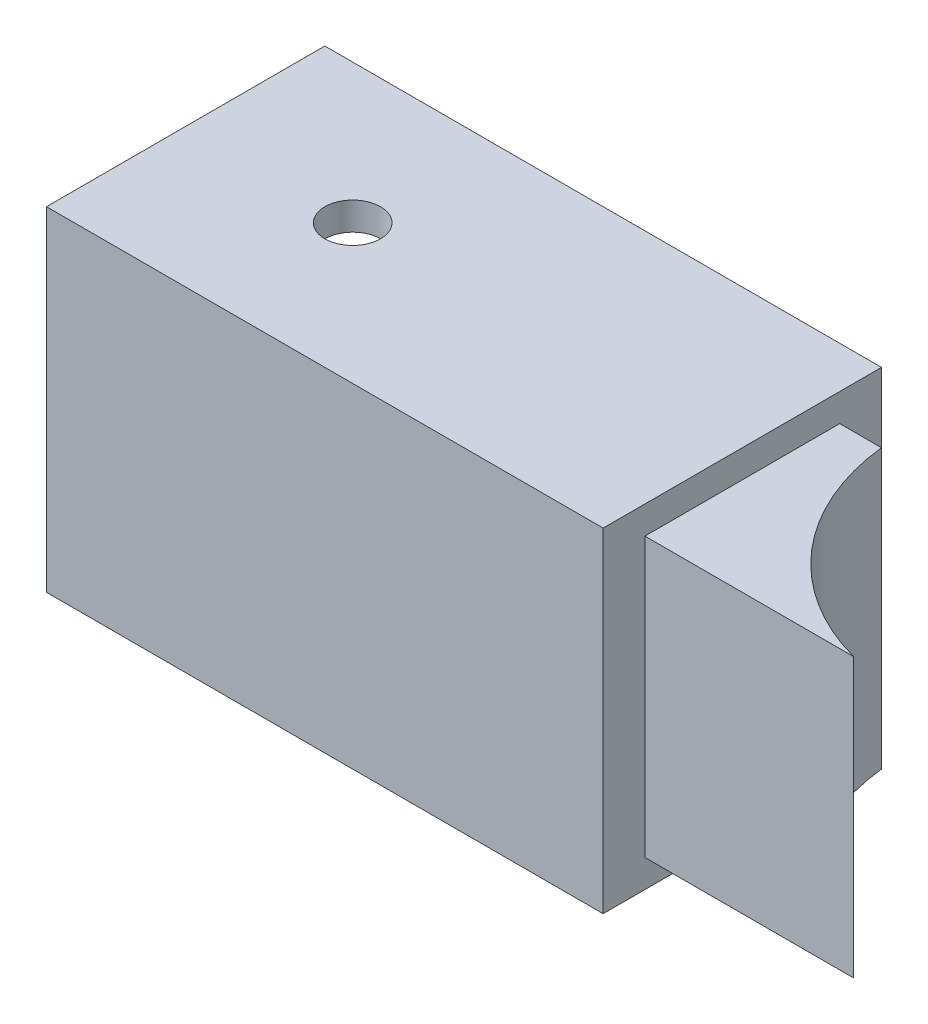
ISO-10303-21;
HEADER;
FILE_DESCRIPTION(('STEP AP214'),'2;1');
FILE_NAME('part.step','',(''),(''),'','','');
FILE_SCHEMA(('AUTOMOTIVE_DESIGN { 1 0 10303 214 1 1 1 1 }'));
ENDSEC;
DATA;
#1=APPLICATION_CONTEXT('core data for automotive mechanical design processes');
#2=APPLICATION_PROTOCOL_DEFINITION('international standard','automotive_design',2000,#1);
#3=PRODUCT_CONTEXT('',#1,'mechanical');
#4=PRODUCT('Part','Part','',(#3));
#5=PRODUCT_RELATED_PRODUCT_CATEGORY('part','',(#4));
#6=PRODUCT_DEFINITION_FORMATION('','',#4);
#7=PRODUCT_DEFINITION_CONTEXT('part definition',#1,'design');
#8=PRODUCT_DEFINITION('design','',#6,#7);
#9=PRODUCT_DEFINITION_SHAPE('','',#8);
#10=(LENGTH_UNIT() NAMED_UNIT(*) SI_UNIT(.MILLI.,.METRE.));
#11=(NAMED_UNIT(*) PLANE_ANGLE_UNIT() SI_UNIT($,.RADIAN.));
#12=(NAMED_UNIT(*) SI_UNIT($,.STERADIAN.) SOLID_ANGLE_UNIT());
#13=UNCERTAINTY_MEASURE_WITH_UNIT(LENGTH_MEASURE(1.E-05),#10,'distance_accuracy_value','');
#14=(GEOMETRIC_REPRESENTATION_CONTEXT(3) GLOBAL_UNCERTAINTY_ASSIGNED_CONTEXT((#13)) GLOBAL_UNIT_ASSIGNED_CONTEXT((#10,
#11,#12)) REPRESENTATION_CONTEXT('',''));
#15=CARTESIAN_POINT('',(0.,0.,0.));
#16=DIRECTION('',(0.,0.,1.));
#17=DIRECTION('',(1.,0.,0.));
#18=AXIS2_PLACEMENT_3D('',#15,#16,#17);
#19=CARTESIAN_POINT('',(-50.,-30.,50.));
#20=DIRECTION('',(-1.,0.,0.));
#21=DIRECTION('',(0.,0.,1.));
#22=AXIS2_PLACEMENT_3D('',#19,#20,#21);
#23=PLANE('',#22);
#24=DIRECTION('',(0.,1.,0.));
#25=VECTOR('',#24,1.);
#26=CARTESIAN_POINT('',(-50.,-30.,0.));
#27=LINE('',#26,#25);
#28=CARTESIAN_POINT('',(-50.,25.,0.));
#29=VERTEX_POINT('',#28);
#30=CARTESIAN_POINT('',(-50.,30.,0.));
#31=VERTEX_POINT('',#30);
#32=EDGE_CURVE('E319',#29,#31,#27,.T.);
#33=ORIENTED_EDGE('',*,*,#32,.F.);
#34=DIRECTION('',(0.,0.,-1.));
#35=VECTOR('',#34,1.);
#36=CARTESIAN_POINT('',(-50.,25.,50.));
#37=LINE('',#36,#35);
#38=CARTESIAN_POINT('',(-50.,25.,45.));
#39=VERTEX_POINT('',#38);
#40=EDGE_CURVE('E301',#39,#29,#37,.T.);
#41=ORIENTED_EDGE('',*,*,#40,.F.);
#42=DIRECTION('',(0.,1.,0.));
#43=VECTOR('',#42,1.);
#44=CARTESIAN_POINT('',(-50.,0.,45.));
#45=LINE('',#44,#43);
#46=CARTESIAN_POINT('',(-50.,-25.,45.));
#47=VERTEX_POINT('',#46);
#48=EDGE_CURVE('E290',#47,#39,#45,.T.);
#49=ORIENTED_EDGE('',*,*,#48,.F.);
#50=DIRECTION('',(0.,0.,-1.));
#51=VECTOR('',#50,1.);
#52=CARTESIAN_POINT('',(-50.,-25.,50.));
#53=LINE('',#52,#51);
#54=CARTESIAN_POINT('',(-50.,-25.,0.));
#55=VERTEX_POINT('',#54);
#56=EDGE_CURVE('E296',#47,#55,#53,.T.);
#57=ORIENTED_EDGE('',*,*,#56,.T.);
#58=CARTESIAN_POINT('',(-50.,-30.,0.));
#59=VERTEX_POINT('',#58);
#60=EDGE_CURVE('E340',#59,#55,#27,.T.);
#61=ORIENTED_EDGE('',*,*,#60,.F.);
#62=DIRECTION('',(0.,0.,-1.));
#63=VECTOR('',#62,1.);
#64=CARTESIAN_POINT('',(-50.,-30.,50.));
#65=LINE('',#64,#63);
#66=CARTESIAN_POINT('',(-50.,-30.,50.));
#67=VERTEX_POINT('',#66);
#68=EDGE_CURVE('E354',#67,#59,#65,.T.);
#69=ORIENTED_EDGE('',*,*,#68,.F.);
#70=DIRECTION('',(0.,1.,0.));
#71=VECTOR('',#70,1.);
#72=CARTESIAN_POINT('',(-50.,-30.,50.));
#73=LINE('',#72,#71);
#74=CARTESIAN_POINT('',(-50.,30.,50.));
#75=VERTEX_POINT('',#74);
#76=EDGE_CURVE('E324',#67,#75,#73,.T.);
#77=ORIENTED_EDGE('',*,*,#76,.T.);
#78=DIRECTION('',(0.,0.,-1.));
#79=VECTOR('',#78,1.);
#80=CARTESIAN_POINT('',(-50.,30.,50.));
#81=LINE('',#80,#79);
#82=EDGE_CURVE('E339',#75,#31,#81,.T.);
#83=ORIENTED_EDGE('',*,*,#82,.T.);
#84=EDGE_LOOP('',(#33,#41,#49,#57,#61,#69,#77,#83));
#85=FACE_BOUND('',#84,.T.);
#86=ADVANCED_FACE('F41',(#85),#23,.T.);
#87=CARTESIAN_POINT('',(-50.,-30.,50.));
#88=DIRECTION('',(0.,1.,0.));
#89=DIRECTION('',(0.,0.,1.));
#90=AXIS2_PLACEMENT_3D('',#87,#88,#89);
#91=PLANE('',#90);
#92=CARTESIAN_POINT('',(-20.,-30.,25.));
#93=DIRECTION('',(0.,1.,0.));
#94=DIRECTION('',(0.,0.,1.));
#95=AXIS2_PLACEMENT_3D('',#92,#93,#94);
#96=CIRCLE('',#95,5.);
#97=CARTESIAN_POINT('',(-20.,-30.,30.));
#98=VERTEX_POINT('',#97);
#99=EDGE_CURVE('E257',#98,#98,#96,.T.);
#100=ORIENTED_EDGE('',*,*,#99,.T.);
#101=EDGE_LOOP('',(#100));
#102=FACE_BOUND('',#101,.T.);
#103=DIRECTION('',(1.,0.,0.));
#104=VECTOR('',#103,1.);
#105=CARTESIAN_POINT('',(-50.,-30.,0.));
#106=LINE('',#105,#104);
#107=CARTESIAN_POINT('',(50.,-30.,0.));
#108=VERTEX_POINT('',#107);
#109=EDGE_CURVE('E329',#59,#108,#106,.T.);
#110=ORIENTED_EDGE('',*,*,#109,.T.);
#111=DIRECTION('',(0.,0.,-1.));
#112=VECTOR('',#111,1.);
#113=CARTESIAN_POINT('',(50.,-30.,50.));
#114=LINE('',#113,#112);
#115=CARTESIAN_POINT('',(50.,-30.,50.));
#116=VERTEX_POINT('',#115);
#117=EDGE_CURVE('E357',#116,#108,#114,.T.);
#118=ORIENTED_EDGE('',*,*,#117,.F.);
#119=DIRECTION('',(1.,0.,0.));
#120=VECTOR('',#119,1.);
#121=CARTESIAN_POINT('',(-50.,-30.,50.));
#122=LINE('',#121,#120);
#123=EDGE_CURVE('E336',#67,#116,#122,.T.);
#124=ORIENTED_EDGE('',*,*,#123,.F.);
#125=ORIENTED_EDGE('',*,*,#68,.T.);
#126=EDGE_LOOP('',(#110,#118,#124,#125));
#127=FACE_BOUND('',#126,.T.);
#128=ADVANCED_FACE('F399',(#102,#127),#91,.F.);
#129=CARTESIAN_POINT('',(50.,-30.,50.));
#130=DIRECTION('',(-1.,0.,0.));
#131=DIRECTION('',(0.,0.,1.));
#132=AXIS2_PLACEMENT_3D('',#129,#130,#131);
#133=PLANE('',#132);
#134=DIRECTION('',(0.,1.,0.));
#135=VECTOR('',#134,1.);
#136=CARTESIAN_POINT('',(50.,-30.,0.));
#137=LINE('',#136,#135);
#138=CARTESIAN_POINT('',(50.,30.,0.));
#139=VERTEX_POINT('',#138);
#140=EDGE_CURVE('E348',#108,#139,#137,.T.);
#141=ORIENTED_EDGE('',*,*,#140,.T.);
#142=DIRECTION('',(0.,0.,-1.));
#143=VECTOR('',#142,1.);
#144=CARTESIAN_POINT('',(50.,30.,50.));
#145=LINE('',#144,#143);
#146=CARTESIAN_POINT('',(50.,30.,50.));
#147=VERTEX_POINT('',#146);
#148=EDGE_CURVE('E360',#147,#139,#145,.T.);
#149=ORIENTED_EDGE('',*,*,#148,.F.);
#150=DIRECTION('',(0.,1.,0.));
#151=VECTOR('',#150,1.);
#152=CARTESIAN_POINT('',(50.,-30.,50.));
#153=LINE('',#152,#151);
#154=EDGE_CURVE('E333',#116,#147,#153,.T.);
#155=ORIENTED_EDGE('',*,*,#154,.F.);
#156=ORIENTED_EDGE('',*,*,#117,.T.);
#157=EDGE_LOOP('',(#141,#149,#155,#156));
#158=FACE_BOUND('',#157,.T.);
#159=DIRECTION('',(0.,1.,0.));
#160=VECTOR('',#159,1.);
#161=CARTESIAN_POINT('',(50.,-30.,7.5));
#162=LINE('',#161,#160);
#163=CARTESIAN_POINT('',(50.,-25.,7.5));
#164=VERTEX_POINT('',#163);
#165=CARTESIAN_POINT('',(50.,25.,7.5));
#166=VERTEX_POINT('',#165);
#167=EDGE_CURVE('E237',#164,#166,#162,.T.);
#168=ORIENTED_EDGE('',*,*,#167,.F.);
#169=DIRECTION('',(0.,0.,1.));
#170=VECTOR('',#169,1.);
#171=CARTESIAN_POINT('',(50.,-25.,50.));
#172=LINE('',#171,#170);
#173=CARTESIAN_POINT('',(50.,-25.,42.5));
#174=VERTEX_POINT('',#173);
#175=EDGE_CURVE('E217',#164,#174,#172,.T.);
#176=ORIENTED_EDGE('',*,*,#175,.T.);
#177=DIRECTION('',(0.,1.,0.));
#178=VECTOR('',#177,1.);
#179=CARTESIAN_POINT('',(50.,-30.,42.5));
#180=LINE('',#179,#178);
#181=CARTESIAN_POINT('',(50.,25.,42.5));
#182=VERTEX_POINT('',#181);
#183=EDGE_CURVE('E241',#174,#182,#180,.T.);
#184=ORIENTED_EDGE('',*,*,#183,.T.);
#185=DIRECTION('',(0.,0.,-1.));
#186=VECTOR('',#185,1.);
#187=CARTESIAN_POINT('',(50.,25.,50.));
#188=LINE('',#187,#186);
#189=EDGE_CURVE('E215',#182,#166,#188,.T.);
#190=ORIENTED_EDGE('',*,*,#189,.T.);
#191=EDGE_LOOP('',(#168,#176,#184,#190));
#192=FACE_BOUND('',#191,.T.);
#193=ADVANCED_FACE('F384',(#158,#192),#133,.F.);
#194=CARTESIAN_POINT('',(-50.,30.,50.));
#195=DIRECTION('',(0.,1.,0.));
#196=DIRECTION('',(0.,0.,1.));
#197=AXIS2_PLACEMENT_3D('',#194,#195,#196);
#198=PLANE('',#197);
#199=ORIENTED_EDGE('',*,*,#148,.T.);
#200=DIRECTION('',(1.,0.,0.));
#201=VECTOR('',#200,1.);
#202=CARTESIAN_POINT('',(-50.,30.,0.));
#203=LINE('',#202,#201);
#204=EDGE_CURVE('E344',#31,#139,#203,.T.);
#205=ORIENTED_EDGE('',*,*,#204,.F.);
#206=ORIENTED_EDGE('',*,*,#82,.F.);
#207=DIRECTION('',(1.,0.,0.));
#208=VECTOR('',#207,1.);
#209=CARTESIAN_POINT('',(-50.,30.,50.));
#210=LINE('',#209,#208);
#211=EDGE_CURVE('E328',#75,#147,#210,.T.);
#212=ORIENTED_EDGE('',*,*,#211,.T.);
#213=EDGE_LOOP('',(#199,#205,#206,#212));
#214=FACE_BOUND('',#213,.T.);
#215=CARTESIAN_POINT('',(-20.,30.,25.));
#216=DIRECTION('',(0.,1.,0.));
#217=DIRECTION('',(0.,0.,1.));
#218=AXIS2_PLACEMENT_3D('',#215,#216,#217);
#219=CIRCLE('',#218,5.);
#220=CARTESIAN_POINT('',(-20.,30.,30.));
#221=VERTEX_POINT('',#220);
#222=EDGE_CURVE('E253',#221,#221,#219,.T.);
#223=ORIENTED_EDGE('',*,*,#222,.F.);
#224=EDGE_LOOP('',(#223));
#225=FACE_BOUND('',#224,.T.);
#226=ADVANCED_FACE('F452',(#214,#225),#198,.T.);
#227=CARTESIAN_POINT('',(0.,0.,50.));
#228=DIRECTION('',(0.,0.,-1.));
#229=DIRECTION('',(-1.,0.,0.));
#230=AXIS2_PLACEMENT_3D('',#227,#228,#229);
#231=PLANE('',#230);
#232=ORIENTED_EDGE('',*,*,#76,.F.);
#233=ORIENTED_EDGE('',*,*,#123,.T.);
#234=ORIENTED_EDGE('',*,*,#154,.T.);
#235=ORIENTED_EDGE('',*,*,#211,.F.);
#236=EDGE_LOOP('',(#232,#233,#234,#235));
#237=FACE_BOUND('',#236,.T.);
#238=ADVANCED_FACE('F449',(#237),#231,.F.);
#239=CARTESIAN_POINT('',(0.,0.,0.));
#240=DIRECTION('',(0.,0.,-1.));
#241=DIRECTION('',(-1.,0.,0.));
#242=AXIS2_PLACEMENT_3D('',#239,#240,#241);
#243=PLANE('',#242);
#244=DIRECTION('',(1.,0.,0.));
#245=VECTOR('',#244,1.);
#246=CARTESIAN_POINT('',(0.,25.,0.));
#247=LINE('',#246,#245);
#248=CARTESIAN_POINT('',(10.,25.,0.));
#249=VERTEX_POINT('',#248);
#250=EDGE_CURVE('E283',#29,#249,#247,.T.);
#251=ORIENTED_EDGE('',*,*,#250,.F.);
#252=ORIENTED_EDGE('',*,*,#32,.T.);
#253=ORIENTED_EDGE('',*,*,#204,.T.);
#254=ORIENTED_EDGE('',*,*,#140,.F.);
#255=ORIENTED_EDGE('',*,*,#109,.F.);
#256=ORIENTED_EDGE('',*,*,#60,.T.);
#257=DIRECTION('',(-1.,0.,0.));
#258=VECTOR('',#257,1.);
#259=CARTESIAN_POINT('',(0.,-25.,0.));
#260=LINE('',#259,#258);
#261=CARTESIAN_POINT('',(10.,-25.,0.));
#262=VERTEX_POINT('',#261);
#263=EDGE_CURVE('E274',#262,#55,#260,.T.);
#264=ORIENTED_EDGE('',*,*,#263,.F.);
#265=DIRECTION('',(0.,-1.,0.));
#266=VECTOR('',#265,1.);
#267=CARTESIAN_POINT('',(10.,0.,0.));
#268=LINE('',#267,#266);
#269=EDGE_CURVE('E280',#249,#262,#268,.T.);
#270=ORIENTED_EDGE('',*,*,#269,.F.);
#271=EDGE_LOOP('',(#251,#252,#253,#254,#255,#256,#264,#270));
#272=FACE_BOUND('',#271,.T.);
#273=ADVANCED_FACE('F415',(#272),#243,.T.);
#274=CARTESIAN_POINT('',(-50.,-25.,50.));
#275=DIRECTION('',(0.,1.,0.));
#276=DIRECTION('',(0.,0.,1.));
#277=AXIS2_PLACEMENT_3D('',#274,#275,#276);
#278=PLANE('',#277);
#279=CARTESIAN_POINT('',(-20.,-25.,25.));
#280=DIRECTION('',(0.,1.,0.));
#281=DIRECTION('',(0.,0.,1.));
#282=AXIS2_PLACEMENT_3D('',#279,#280,#281);
#283=CIRCLE('',#282,5.);
#284=CARTESIAN_POINT('',(-20.,-25.,30.));
#285=VERTEX_POINT('',#284);
#286=EDGE_CURVE('E262',#285,#285,#283,.T.);
#287=ORIENTED_EDGE('',*,*,#286,.F.);
#288=EDGE_LOOP('',(#287));
#289=FACE_BOUND('',#288,.T.);
#290=DIRECTION('',(1.,0.,0.));
#291=VECTOR('',#290,1.);
#292=CARTESIAN_POINT('',(0.,-25.,5.));
#293=LINE('',#292,#291);
#294=CARTESIAN_POINT('',(10.,-25.,5.));
#295=VERTEX_POINT('',#294);
#296=CARTESIAN_POINT('',(45.,-25.,5.));
#297=VERTEX_POINT('',#296);
#298=EDGE_CURVE('E287',#295,#297,#293,.T.);
#299=ORIENTED_EDGE('',*,*,#298,.F.);
#300=DIRECTION('',(0.,0.,1.));
#301=VECTOR('',#300,1.);
#302=CARTESIAN_POINT('',(10.,-25.,-5.));
#303=LINE('',#302,#301);
#304=EDGE_CURVE('E270',#262,#295,#303,.T.);
#305=ORIENTED_EDGE('',*,*,#304,.F.);
#306=ORIENTED_EDGE('',*,*,#263,.T.);
#307=ORIENTED_EDGE('',*,*,#56,.F.);
#308=DIRECTION('',(1.,0.,0.));
#309=VECTOR('',#308,1.);
#310=CARTESIAN_POINT('',(0.,-25.,45.));
#311=LINE('',#310,#309);
#312=CARTESIAN_POINT('',(45.,-25.,45.));
#313=VERTEX_POINT('',#312);
#314=EDGE_CURVE('E298',#47,#313,#311,.T.);
#315=ORIENTED_EDGE('',*,*,#314,.T.);
#316=DIRECTION('',(0.,0.,-1.));
#317=VECTOR('',#316,1.);
#318=CARTESIAN_POINT('',(45.,-25.,50.));
#319=LINE('',#318,#317);
#320=EDGE_CURVE('E292',#313,#297,#319,.T.);
#321=ORIENTED_EDGE('',*,*,#320,.T.);
#322=EDGE_LOOP('',(#299,#305,#306,#307,#315,#321));
#323=FACE_BOUND('',#322,.T.);
#324=ADVANCED_FACE('F440',(#289,#323),#278,.T.);
#325=CARTESIAN_POINT('',(45.,-30.,50.));
#326=DIRECTION('',(-1.,0.,0.));
#327=DIRECTION('',(0.,0.,1.));
#328=AXIS2_PLACEMENT_3D('',#325,#326,#327);
#329=PLANE('',#328);
#330=DIRECTION('',(0.,1.,0.));
#331=VECTOR('',#330,1.);
#332=CARTESIAN_POINT('',(45.,-30.,37.5));
#333=LINE('',#332,#331);
#334=CARTESIAN_POINT('',(45.,-20.,37.5));
#335=VERTEX_POINT('',#334);
#336=CARTESIAN_POINT('',(45.,20.,37.5));
#337=VERTEX_POINT('',#336);
#338=EDGE_CURVE('E165',#335,#337,#333,.T.);
#339=ORIENTED_EDGE('',*,*,#338,.F.);
#340=DIRECTION('',(0.,0.,1.));
#341=VECTOR('',#340,1.);
#342=CARTESIAN_POINT('',(45.,-20.,50.));
#343=LINE('',#342,#341);
#344=CARTESIAN_POINT('',(45.,-20.,12.5));
#345=VERTEX_POINT('',#344);
#346=EDGE_CURVE('E194',#345,#335,#343,.T.);
#347=ORIENTED_EDGE('',*,*,#346,.F.);
#348=DIRECTION('',(0.,1.,0.));
#349=VECTOR('',#348,1.);
#350=CARTESIAN_POINT('',(45.,-30.,12.5));
#351=LINE('',#350,#349);
#352=CARTESIAN_POINT('',(45.,20.,12.5));
#353=VERTEX_POINT('',#352);
#354=EDGE_CURVE('E178',#345,#353,#351,.T.);
#355=ORIENTED_EDGE('',*,*,#354,.T.);
#356=DIRECTION('',(0.,0.,-1.));
#357=VECTOR('',#356,1.);
#358=CARTESIAN_POINT('',(45.,20.,50.));
#359=LINE('',#358,#357);
#360=EDGE_CURVE('E183',#337,#353,#359,.T.);
#361=ORIENTED_EDGE('',*,*,#360,.F.);
#362=EDGE_LOOP('',(#339,#347,#355,#361));
#363=FACE_BOUND('',#362,.T.);
#364=DIRECTION('',(0.,1.,0.));
#365=VECTOR('',#364,1.);
#366=CARTESIAN_POINT('',(45.,0.,5.));
#367=LINE('',#366,#365);
#368=CARTESIAN_POINT('',(45.,25.,5.));
#369=VERTEX_POINT('',#368);
#370=EDGE_CURVE('E291',#297,#369,#367,.T.);
#371=ORIENTED_EDGE('',*,*,#370,.F.);
#372=ORIENTED_EDGE('',*,*,#320,.F.);
#373=DIRECTION('',(0.,1.,0.));
#374=VECTOR('',#373,1.);
#375=CARTESIAN_POINT('',(45.,0.,45.));
#376=LINE('',#375,#374);
#377=CARTESIAN_POINT('',(45.,25.,45.));
#378=VERTEX_POINT('',#377);
#379=EDGE_CURVE('E302',#313,#378,#376,.T.);
#380=ORIENTED_EDGE('',*,*,#379,.T.);
#381=DIRECTION('',(0.,0.,-1.));
#382=VECTOR('',#381,1.);
#383=CARTESIAN_POINT('',(45.,25.,50.));
#384=LINE('',#383,#382);
#385=EDGE_CURVE('E297',#378,#369,#384,.T.);
#386=ORIENTED_EDGE('',*,*,#385,.T.);
#387=EDGE_LOOP('',(#371,#372,#380,#386));
#388=FACE_BOUND('',#387,.T.);
#389=ADVANCED_FACE('F191',(#363,#388),#329,.T.);
#390=CARTESIAN_POINT('',(-50.,25.,50.));
#391=DIRECTION('',(0.,1.,0.));
#392=DIRECTION('',(0.,0.,1.));
#393=AXIS2_PLACEMENT_3D('',#390,#391,#392);
#394=PLANE('',#393);
#395=CARTESIAN_POINT('',(-20.,25.,25.));
#396=DIRECTION('',(0.,1.,0.));
#397=DIRECTION('',(0.,0.,1.));
#398=AXIS2_PLACEMENT_3D('',#395,#396,#397);
#399=CIRCLE('',#398,5.);
#400=CARTESIAN_POINT('',(-20.,25.,30.));
#401=VERTEX_POINT('',#400);
#402=EDGE_CURVE('E261',#401,#401,#399,.T.);
#403=ORIENTED_EDGE('',*,*,#402,.T.);
#404=EDGE_LOOP('',(#403));
#405=FACE_BOUND('',#404,.T.);
#406=ORIENTED_EDGE('',*,*,#40,.T.);
#407=ORIENTED_EDGE('',*,*,#250,.T.);
#408=DIRECTION('',(0.,0.,1.));
#409=VECTOR('',#408,1.);
#410=CARTESIAN_POINT('',(10.,25.,-5.));
#411=LINE('',#410,#409);
#412=CARTESIAN_POINT('',(10.,25.,5.));
#413=VERTEX_POINT('',#412);
#414=EDGE_CURVE('E271',#249,#413,#411,.T.);
#415=ORIENTED_EDGE('',*,*,#414,.T.);
#416=DIRECTION('',(1.,0.,0.));
#417=VECTOR('',#416,1.);
#418=CARTESIAN_POINT('',(0.,25.,5.));
#419=LINE('',#418,#417);
#420=EDGE_CURVE('E286',#413,#369,#419,.T.);
#421=ORIENTED_EDGE('',*,*,#420,.T.);
#422=ORIENTED_EDGE('',*,*,#385,.F.);
#423=DIRECTION('',(1.,0.,0.));
#424=VECTOR('',#423,1.);
#425=CARTESIAN_POINT('',(0.,25.,45.));
#426=LINE('',#425,#424);
#427=EDGE_CURVE('E311',#39,#378,#426,.T.);
#428=ORIENTED_EDGE('',*,*,#427,.F.);
#429=EDGE_LOOP('',(#406,#407,#415,#421,#422,#428));
#430=FACE_BOUND('',#429,.T.);
#431=ADVANCED_FACE('F421',(#405,#430),#394,.F.);
#432=CARTESIAN_POINT('',(0.,0.,45.));
#433=DIRECTION('',(0.,0.,-1.));
#434=DIRECTION('',(-1.,0.,0.));
#435=AXIS2_PLACEMENT_3D('',#432,#433,#434);
#436=PLANE('',#435);
#437=ORIENTED_EDGE('',*,*,#48,.T.);
#438=ORIENTED_EDGE('',*,*,#427,.T.);
#439=ORIENTED_EDGE('',*,*,#379,.F.);
#440=ORIENTED_EDGE('',*,*,#314,.F.);
#441=EDGE_LOOP('',(#437,#438,#439,#440));
#442=FACE_BOUND('',#441,.T.);
#443=ADVANCED_FACE('F437',(#442),#436,.T.);
#444=CARTESIAN_POINT('',(0.,0.,5.));
#445=DIRECTION('',(0.,0.,-1.));
#446=DIRECTION('',(-1.,0.,0.));
#447=AXIS2_PLACEMENT_3D('',#444,#445,#446);
#448=PLANE('',#447);
#449=ORIENTED_EDGE('',*,*,#420,.F.);
#450=DIRECTION('',(0.,1.,0.));
#451=VECTOR('',#450,1.);
#452=CARTESIAN_POINT('',(10.,25.,5.));
#453=LINE('',#452,#451);
#454=EDGE_CURVE('E266',#295,#413,#453,.T.);
#455=ORIENTED_EDGE('',*,*,#454,.F.);
#456=ORIENTED_EDGE('',*,*,#298,.T.);
#457=ORIENTED_EDGE('',*,*,#370,.T.);
#458=EDGE_LOOP('',(#449,#455,#456,#457));
#459=FACE_BOUND('',#458,.T.);
#460=ADVANCED_FACE('F430',(#459),#448,.F.);
#461=CARTESIAN_POINT('',(10.,25.,-5.));
#462=DIRECTION('',(1.,0.,0.));
#463=DIRECTION('',(0.,1.,0.));
#464=AXIS2_PLACEMENT_3D('',#461,#462,#463);
#465=PLANE('',#464);
#466=ORIENTED_EDGE('',*,*,#269,.T.);
#467=ORIENTED_EDGE('',*,*,#304,.T.);
#468=ORIENTED_EDGE('',*,*,#454,.T.);
#469=ORIENTED_EDGE('',*,*,#414,.F.);
#470=EDGE_LOOP('',(#466,#467,#468,#469));
#471=FACE_BOUND('',#470,.T.);
#472=ADVANCED_FACE('F424',(#471),#465,.F.);
#473=CARTESIAN_POINT('',(-20.,-30.,25.));
#474=DIRECTION('',(0.,1.,0.));
#475=DIRECTION('',(0.,0.,1.));
#476=AXIS2_PLACEMENT_3D('',#473,#474,#475);
#477=CYLINDRICAL_SURFACE('',#476,5.);
#478=ORIENTED_EDGE('',*,*,#222,.T.);
#479=EDGE_LOOP('',(#478));
#480=FACE_BOUND('',#479,.T.);
#481=ORIENTED_EDGE('',*,*,#402,.F.);
#482=EDGE_LOOP('',(#481));
#483=FACE_BOUND('',#482,.T.);
#484=ADVANCED_FACE('F395',(#480,#483),#477,.F.);
#485=ORIENTED_EDGE('',*,*,#286,.T.);
#486=EDGE_LOOP('',(#485));
#487=FACE_BOUND('',#486,.T.);
#488=ORIENTED_EDGE('',*,*,#99,.F.);
#489=EDGE_LOOP('',(#488));
#490=FACE_BOUND('',#489,.T.);
#491=ADVANCED_FACE('F388',(#487,#490),#477,.F.);
#492=CARTESIAN_POINT('',(50.,-30.,7.5));
#493=DIRECTION('',(0.,0.,1.));
#494=DIRECTION('',(1.,0.,0.));
#495=AXIS2_PLACEMENT_3D('',#492,#493,#494);
#496=PLANE('',#495);
#497=DIRECTION('',(0.,1.,0.));
#498=VECTOR('',#497,1.);
#499=CARTESIAN_POINT('',(57.5,-30.,7.50000000000001));
#500=LINE('',#499,#498);
#501=CARTESIAN_POINT('',(57.5,-25.,7.50000000000001));
#502=VERTEX_POINT('',#501);
#503=CARTESIAN_POINT('',(57.5,25.,7.50000000000001));
#504=VERTEX_POINT('',#503);
#505=EDGE_CURVE('E249',#502,#504,#500,.T.);
#506=ORIENTED_EDGE('',*,*,#505,.F.);
#507=DIRECTION('',(-1.,0.,0.));
#508=VECTOR('',#507,1.);
#509=CARTESIAN_POINT('',(50.,-25.,7.5));
#510=LINE('',#509,#508);
#511=EDGE_CURVE('E233',#502,#164,#510,.T.);
#512=ORIENTED_EDGE('',*,*,#511,.T.);
#513=ORIENTED_EDGE('',*,*,#167,.T.);
#514=DIRECTION('',(1.,0.,0.));
#515=VECTOR('',#514,1.);
#516=CARTESIAN_POINT('',(50.,25.,7.5));
#517=LINE('',#516,#515);
#518=EDGE_CURVE('E227',#166,#504,#517,.T.);
#519=ORIENTED_EDGE('',*,*,#518,.T.);
#520=EDGE_LOOP('',(#506,#512,#513,#519));
#521=FACE_BOUND('',#520,.T.);
#522=ADVANCED_FACE('F386',(#521),#496,.F.);
#523=CARTESIAN_POINT('',(98.1388831226991,-30.,3.02381446625795));
#524=DIRECTION('',(0.,1.,0.));
#525=DIRECTION('',(0.,0.,1.));
#526=AXIS2_PLACEMENT_3D('',#523,#524,#525);
#527=CYLINDRICAL_SURFACE('',#526,40.8846555371679);
#528=CARTESIAN_POINT('',(98.1388831226991,-25.,3.02381446625795));
#529=DIRECTION('',(0.,1.,0.));
#530=DIRECTION('',(0.,0.,1.));
#531=AXIS2_PLACEMENT_3D('',#528,#529,#530);
#532=CIRCLE('',#531,40.8846555371679);
#533=CARTESIAN_POINT('',(87.5,-25.,42.5));
#534=VERTEX_POINT('',#533);
#535=EDGE_CURVE('E63',#502,#534,#532,.T.);
#536=ORIENTED_EDGE('',*,*,#535,.F.);
#537=ORIENTED_EDGE('',*,*,#505,.T.);
#538=CARTESIAN_POINT('',(98.1388831226991,25.,3.02381446625795));
#539=DIRECTION('',(0.,-1.,0.));
#540=DIRECTION('',(0.,0.,-1.));
#541=AXIS2_PLACEMENT_3D('',#538,#539,#540);
#542=CIRCLE('',#541,40.8846555371679);
#543=CARTESIAN_POINT('',(87.5,25.,42.5));
#544=VERTEX_POINT('',#543);
#545=EDGE_CURVE('E221',#544,#504,#542,.T.);
#546=ORIENTED_EDGE('',*,*,#545,.F.);
#547=DIRECTION('',(0.,1.,0.));
#548=VECTOR('',#547,1.);
#549=CARTESIAN_POINT('',(87.5,-30.,42.5));
#550=LINE('',#549,#548);
#551=EDGE_CURVE('E245',#534,#544,#550,.T.);
#552=ORIENTED_EDGE('',*,*,#551,.F.);
#553=EDGE_LOOP('',(#536,#537,#546,#552));
#554=FACE_BOUND('',#553,.T.);
#555=ADVANCED_FACE('F378',(#554),#527,.F.);
#556=CARTESIAN_POINT('',(50.,-30.,42.5));
#557=DIRECTION('',(0.,0.,1.));
#558=DIRECTION('',(1.,0.,0.));
#559=AXIS2_PLACEMENT_3D('',#556,#557,#558);
#560=PLANE('',#559);
#561=DIRECTION('',(-1.,0.,0.));
#562=VECTOR('',#561,1.);
#563=CARTESIAN_POINT('',(50.,-25.,42.5));
#564=LINE('',#563,#562);
#565=EDGE_CURVE('E11',#534,#174,#564,.T.);
#566=ORIENTED_EDGE('',*,*,#565,.F.);
#567=ORIENTED_EDGE('',*,*,#551,.T.);
#568=DIRECTION('',(1.,0.,0.));
#569=VECTOR('',#568,1.);
#570=CARTESIAN_POINT('',(50.,25.,42.5));
#571=LINE('',#570,#569);
#572=EDGE_CURVE('E49',#182,#544,#571,.T.);
#573=ORIENTED_EDGE('',*,*,#572,.F.);
#574=ORIENTED_EDGE('',*,*,#183,.F.);
#575=EDGE_LOOP('',(#566,#567,#573,#574));
#576=FACE_BOUND('',#575,.T.);
#577=ADVANCED_FACE('F380',(#576),#560,.T.);
#578=CARTESIAN_POINT('',(-0.249378105604436,25.,50.));
#579=DIRECTION('',(0.,-1.,0.));
#580=DIRECTION('',(0.,0.,-1.));
#581=AXIS2_PLACEMENT_3D('',#578,#579,#580);
#582=PLANE('',#581);
#583=ORIENTED_EDGE('',*,*,#189,.F.);
#584=ORIENTED_EDGE('',*,*,#572,.T.);
#585=ORIENTED_EDGE('',*,*,#545,.T.);
#586=ORIENTED_EDGE('',*,*,#518,.F.);
#587=EDGE_LOOP('',(#583,#584,#585,#586));
#588=FACE_BOUND('',#587,.T.);
#589=ADVANCED_FACE('F373',(#588),#582,.F.);
#590=CARTESIAN_POINT('',(-0.249378105604436,-25.,50.));
#591=DIRECTION('',(0.,1.,0.));
#592=DIRECTION('',(0.,0.,1.));
#593=AXIS2_PLACEMENT_3D('',#590,#591,#592);
#594=PLANE('',#593);
#595=ORIENTED_EDGE('',*,*,#535,.T.);
#596=ORIENTED_EDGE('',*,*,#565,.T.);
#597=ORIENTED_EDGE('',*,*,#175,.F.);
#598=ORIENTED_EDGE('',*,*,#511,.F.);
#599=EDGE_LOOP('',(#595,#596,#597,#598));
#600=FACE_BOUND('',#599,.T.);
#601=ADVANCED_FACE('F381',(#600),#594,.F.);
#602=CARTESIAN_POINT('',(50.,-30.,12.5));
#603=DIRECTION('',(0.,0.,1.));
#604=DIRECTION('',(1.,0.,0.));
#605=AXIS2_PLACEMENT_3D('',#602,#603,#604);
#606=PLANE('',#605);
#607=DIRECTION('',(0.,1.,0.));
#608=VECTOR('',#607,1.);
#609=CARTESIAN_POINT('',(53.2434098375821,-20.,12.5));
#610=LINE('',#609,#608);
#611=CARTESIAN_POINT('',(53.2434098375821,-20.,12.5));
#612=VERTEX_POINT('',#611);
#613=CARTESIAN_POINT('',(53.2434098375821,20.,12.5));
#614=VERTEX_POINT('',#613);
#615=EDGE_CURVE('E188',#612,#614,#610,.T.);
#616=ORIENTED_EDGE('',*,*,#615,.T.);
#617=DIRECTION('',(1.,0.,0.));
#618=VECTOR('',#617,1.);
#619=CARTESIAN_POINT('',(50.,20.,12.5));
#620=LINE('',#619,#618);
#621=EDGE_CURVE('E205',#353,#614,#620,.T.);
#622=ORIENTED_EDGE('',*,*,#621,.F.);
#623=ORIENTED_EDGE('',*,*,#354,.F.);
#624=DIRECTION('',(-1.,0.,0.));
#625=VECTOR('',#624,1.);
#626=CARTESIAN_POINT('',(50.,-20.,12.5));
#627=LINE('',#626,#625);
#628=EDGE_CURVE('E56',#612,#345,#627,.T.);
#629=ORIENTED_EDGE('',*,*,#628,.F.);
#630=EDGE_LOOP('',(#616,#622,#623,#629));
#631=FACE_BOUND('',#630,.T.);
#632=ADVANCED_FACE('F560',(#631),#606,.T.);
#633=CARTESIAN_POINT('',(98.1388831226991,-30.,3.02381446625795));
#634=DIRECTION('',(0.,1.,0.));
#635=DIRECTION('',(0.,0.,1.));
#636=AXIS2_PLACEMENT_3D('',#633,#634,#635);
#637=CYLINDRICAL_SURFACE('',#636,45.8846555371679);
#638=CARTESIAN_POINT('',(98.1388831226991,-20.,3.02381446625795));
#639=DIRECTION('',(0.,1.,0.));
#640=DIRECTION('',(0.,0.,1.));
#641=AXIS2_PLACEMENT_3D('',#638,#639,#640);
#642=CIRCLE('',#641,45.8846555371679);
#643=CARTESIAN_POINT('',(67.860272771371,-20.,37.5));
#644=VERTEX_POINT('',#643);
#645=EDGE_CURVE('E204',#612,#644,#642,.T.);
#646=ORIENTED_EDGE('',*,*,#645,.T.);
#647=DIRECTION('',(0.,1.,0.));
#648=VECTOR('',#647,1.);
#649=CARTESIAN_POINT('',(67.860272771371,-20.,37.5));
#650=LINE('',#649,#648);
#651=CARTESIAN_POINT('',(67.860272771371,20.,37.5));
#652=VERTEX_POINT('',#651);
#653=EDGE_CURVE('E177',#644,#652,#650,.T.);
#654=ORIENTED_EDGE('',*,*,#653,.T.);
#655=CARTESIAN_POINT('',(98.1388831226991,20.,3.02381446625795));
#656=DIRECTION('',(0.,-1.,0.));
#657=DIRECTION('',(0.,0.,-1.));
#658=AXIS2_PLACEMENT_3D('',#655,#656,#657);
#659=CIRCLE('',#658,45.8846555371679);
#660=EDGE_CURVE('E185',#652,#614,#659,.T.);
#661=ORIENTED_EDGE('',*,*,#660,.T.);
#662=ORIENTED_EDGE('',*,*,#615,.F.);
#663=EDGE_LOOP('',(#646,#654,#661,#662));
#664=FACE_BOUND('',#663,.T.);
#665=ADVANCED_FACE('F577',(#664),#637,.T.);
#666=CARTESIAN_POINT('',(50.,-30.,37.5));
#667=DIRECTION('',(0.,0.,1.));
#668=DIRECTION('',(1.,0.,0.));
#669=AXIS2_PLACEMENT_3D('',#666,#667,#668);
#670=PLANE('',#669);
#671=DIRECTION('',(-1.,0.,0.));
#672=VECTOR('',#671,1.);
#673=CARTESIAN_POINT('',(50.,-20.,37.5));
#674=LINE('',#673,#672);
#675=EDGE_CURVE('E172',#644,#335,#674,.T.);
#676=ORIENTED_EDGE('',*,*,#675,.T.);
#677=ORIENTED_EDGE('',*,*,#338,.T.);
#678=DIRECTION('',(1.,0.,0.));
#679=VECTOR('',#678,1.);
#680=CARTESIAN_POINT('',(50.,20.,37.5));
#681=LINE('',#680,#679);
#682=EDGE_CURVE('E169',#337,#652,#681,.T.);
#683=ORIENTED_EDGE('',*,*,#682,.T.);
#684=ORIENTED_EDGE('',*,*,#653,.F.);
#685=EDGE_LOOP('',(#676,#677,#683,#684));
#686=FACE_BOUND('',#685,.T.);
#687=ADVANCED_FACE('F167',(#686),#670,.F.);
#688=CARTESIAN_POINT('',(-0.249378105604436,20.,50.));
#689=DIRECTION('',(0.,-1.,0.));
#690=DIRECTION('',(0.,0.,-1.));
#691=AXIS2_PLACEMENT_3D('',#688,#689,#690);
#692=PLANE('',#691);
#693=ORIENTED_EDGE('',*,*,#360,.T.);
#694=ORIENTED_EDGE('',*,*,#621,.T.);
#695=ORIENTED_EDGE('',*,*,#660,.F.);
#696=ORIENTED_EDGE('',*,*,#682,.F.);
#697=EDGE_LOOP('',(#693,#694,#695,#696));
#698=FACE_BOUND('',#697,.T.);
#699=ADVANCED_FACE('F181',(#698),#692,.T.);
#700=CARTESIAN_POINT('',(-0.249378105604436,-20.,50.));
#701=DIRECTION('',(0.,1.,0.));
#702=DIRECTION('',(0.,0.,1.));
#703=AXIS2_PLACEMENT_3D('',#700,#701,#702);
#704=PLANE('',#703);
#705=ORIENTED_EDGE('',*,*,#645,.F.);
#706=ORIENTED_EDGE('',*,*,#628,.T.);
#707=ORIENTED_EDGE('',*,*,#346,.T.);
#708=ORIENTED_EDGE('',*,*,#675,.F.);
#709=EDGE_LOOP('',(#705,#706,#707,#708));
#710=FACE_BOUND('',#709,.T.);
#711=ADVANCED_FACE('F605',(#710),#704,.T.);
#712=CLOSED_SHELL('',(#86,#128,#193,#226,#238,#273,#324,#389,#431,#443,#460,#472,#484,#491,#522,
#555,#577,#589,#601,#632,#665,#687,#699,#711));
#713=MANIFOLD_SOLID_BREP('B2',#712);
#714=ADVANCED_BREP_SHAPE_REPRESENTATION('',(#18,#713),#14);
#715=SHAPE_DEFINITION_REPRESENTATION(#9,#714);
ENDSEC;
END-ISO-10303-21;
